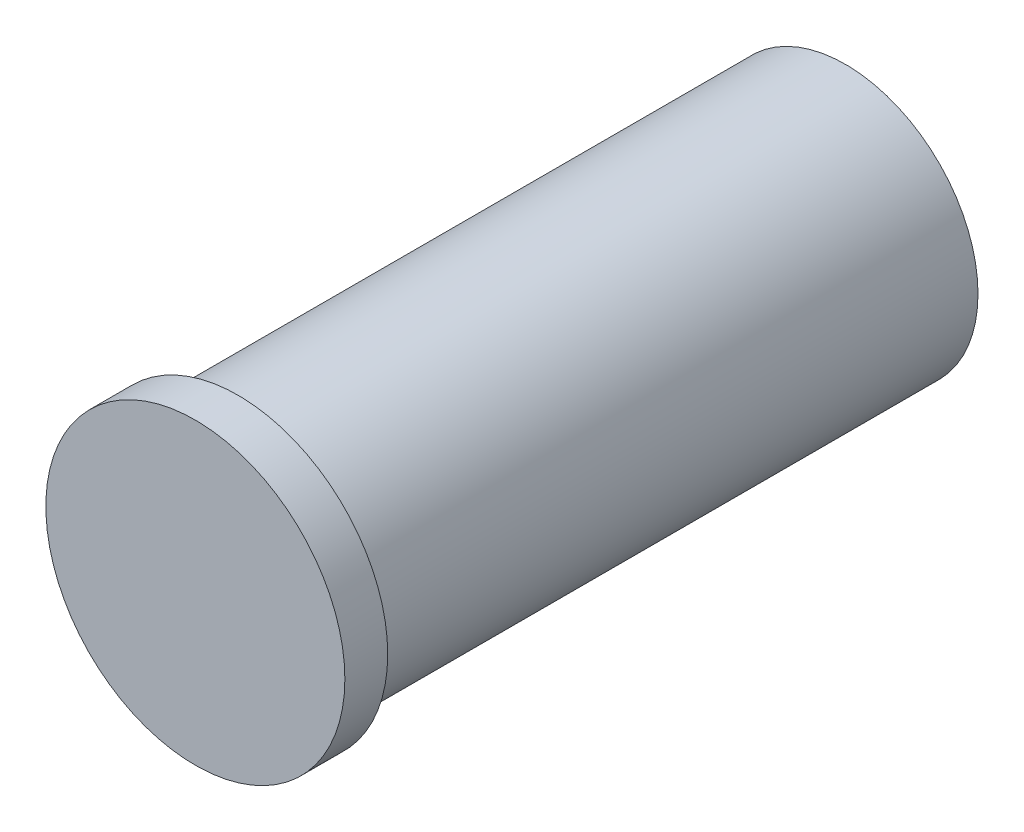
ISO-10303-21;
HEADER;
FILE_DESCRIPTION(('STEP AP214'),'2;1');
FILE_NAME('part.step','',(''),(''),'','','');
FILE_SCHEMA(('AUTOMOTIVE_DESIGN { 1 0 10303 214 1 1 1 1 }'));
ENDSEC;
DATA;
#1=APPLICATION_CONTEXT('core data for automotive mechanical design processes');
#2=APPLICATION_PROTOCOL_DEFINITION('international standard','automotive_design',2000,#1);
#3=PRODUCT_CONTEXT('',#1,'mechanical');
#4=PRODUCT('Part','Part','',(#3));
#5=PRODUCT_RELATED_PRODUCT_CATEGORY('part','',(#4));
#6=PRODUCT_DEFINITION_FORMATION('','',#4);
#7=PRODUCT_DEFINITION_CONTEXT('part definition',#1,'design');
#8=PRODUCT_DEFINITION('design','',#6,#7);
#9=PRODUCT_DEFINITION_SHAPE('','',#8);
#10=(LENGTH_UNIT() NAMED_UNIT(*) SI_UNIT(.MILLI.,.METRE.));
#11=(NAMED_UNIT(*) PLANE_ANGLE_UNIT() SI_UNIT($,.RADIAN.));
#12=(NAMED_UNIT(*) SI_UNIT($,.STERADIAN.) SOLID_ANGLE_UNIT());
#13=UNCERTAINTY_MEASURE_WITH_UNIT(LENGTH_MEASURE(1.E-05),#10,'distance_accuracy_value','');
#14=(GEOMETRIC_REPRESENTATION_CONTEXT(3) GLOBAL_UNCERTAINTY_ASSIGNED_CONTEXT((#13)) GLOBAL_UNIT_ASSIGNED_CONTEXT((#10,
#11,#12)) REPRESENTATION_CONTEXT('',''));
#15=CARTESIAN_POINT('',(0.,0.,0.));
#16=DIRECTION('',(0.,0.,1.));
#17=DIRECTION('',(1.,0.,0.));
#18=AXIS2_PLACEMENT_3D('',#15,#16,#17);
#19=CARTESIAN_POINT('',(0.,0.,18.));
#20=DIRECTION('',(0.,0.,-1.));
#21=DIRECTION('',(-1.,0.,0.));
#22=AXIS2_PLACEMENT_3D('',#19,#20,#21);
#23=CYLINDRICAL_SURFACE('',#22,3.925);
#24=CARTESIAN_POINT('',(0.,0.,18.));
#25=DIRECTION('',(0.,0.,1.));
#26=DIRECTION('',(1.,0.,0.));
#27=AXIS2_PLACEMENT_3D('',#24,#25,#26);
#28=CIRCLE('',#27,3.925);
#29=CARTESIAN_POINT('',(3.925,0.,18.));
#30=VERTEX_POINT('',#29);
#31=EDGE_CURVE('E10',#30,#30,#28,.T.);
#32=ORIENTED_EDGE('',*,*,#31,.F.);
#33=EDGE_LOOP('',(#32));
#34=FACE_BOUND('',#33,.T.);
#35=CARTESIAN_POINT('',(0.,0.,0.));
#36=DIRECTION('',(0.,0.,1.));
#37=DIRECTION('',(1.,0.,0.));
#38=AXIS2_PLACEMENT_3D('',#35,#36,#37);
#39=CIRCLE('',#38,3.925);
#40=CARTESIAN_POINT('',(3.925,0.,0.));
#41=VERTEX_POINT('',#40);
#42=EDGE_CURVE('E46',#41,#41,#39,.T.);
#43=ORIENTED_EDGE('',*,*,#42,.T.);
#44=EDGE_LOOP('',(#43));
#45=FACE_BOUND('',#44,.T.);
#46=ADVANCED_FACE('F43',(#34,#45),#23,.T.);
#47=CARTESIAN_POINT('',(0.,0.,0.));
#48=DIRECTION('',(0.,0.,1.));
#49=DIRECTION('',(1.,0.,0.));
#50=AXIS2_PLACEMENT_3D('',#47,#48,#49);
#51=PLANE('',#50);
#52=ORIENTED_EDGE('',*,*,#42,.F.);
#53=EDGE_LOOP('',(#52));
#54=FACE_BOUND('',#53,.T.);
#55=ADVANCED_FACE('F70',(#54),#51,.F.);
#56=CARTESIAN_POINT('',(0.,0.,19.27));
#57=DIRECTION('',(0.,0.,-1.));
#58=DIRECTION('',(-1.,0.,0.));
#59=AXIS2_PLACEMENT_3D('',#56,#57,#58);
#60=CYLINDRICAL_SURFACE('',#59,4.43114518602886);
#61=CARTESIAN_POINT('',(0.,0.,19.27));
#62=DIRECTION('',(0.,0.,1.));
#63=DIRECTION('',(1.,0.,0.));
#64=AXIS2_PLACEMENT_3D('',#61,#62,#63);
#65=CIRCLE('',#64,4.43114518602886);
#66=CARTESIAN_POINT('',(4.43114518602886,0.,19.27));
#67=VERTEX_POINT('',#66);
#68=EDGE_CURVE('E55',#67,#67,#65,.T.);
#69=ORIENTED_EDGE('',*,*,#68,.F.);
#70=EDGE_LOOP('',(#69));
#71=FACE_BOUND('',#70,.T.);
#72=CARTESIAN_POINT('',(0.,0.,18.));
#73=DIRECTION('',(0.,0.,1.));
#74=DIRECTION('',(1.,0.,0.));
#75=AXIS2_PLACEMENT_3D('',#72,#73,#74);
#76=CIRCLE('',#75,4.43114518602886);
#77=CARTESIAN_POINT('',(4.43114518602886,0.,18.));
#78=VERTEX_POINT('',#77);
#79=EDGE_CURVE('E57',#78,#78,#76,.T.);
#80=ORIENTED_EDGE('',*,*,#79,.T.);
#81=EDGE_LOOP('',(#80));
#82=FACE_BOUND('',#81,.T.);
#83=ADVANCED_FACE('F67',(#71,#82),#60,.T.);
#84=CARTESIAN_POINT('',(0.,0.,19.27));
#85=DIRECTION('',(0.,0.,1.));
#86=DIRECTION('',(1.,0.,0.));
#87=AXIS2_PLACEMENT_3D('',#84,#85,#86);
#88=PLANE('',#87);
#89=ORIENTED_EDGE('',*,*,#68,.T.);
#90=EDGE_LOOP('',(#89));
#91=FACE_BOUND('',#90,.T.);
#92=ADVANCED_FACE('F65',(#91),#88,.T.);
#93=CARTESIAN_POINT('',(0.,0.,18.));
#94=DIRECTION('',(0.,0.,1.));
#95=DIRECTION('',(1.,0.,0.));
#96=AXIS2_PLACEMENT_3D('',#93,#94,#95);
#97=PLANE('',#96);
#98=ORIENTED_EDGE('',*,*,#31,.T.);
#99=EDGE_LOOP('',(#98));
#100=FACE_BOUND('',#99,.T.);
#101=ORIENTED_EDGE('',*,*,#79,.F.);
#102=EDGE_LOOP('',(#101));
#103=FACE_BOUND('',#102,.T.);
#104=ADVANCED_FACE('F74',(#100,#103),#97,.F.);
#105=CLOSED_SHELL('',(#46,#55,#83,#92,#104));
#106=MANIFOLD_SOLID_BREP('B2',#105);
#107=ADVANCED_BREP_SHAPE_REPRESENTATION('',(#18,#106),#14);
#108=SHAPE_DEFINITION_REPRESENTATION(#9,#107);
ENDSEC;
END-ISO-10303-21;
